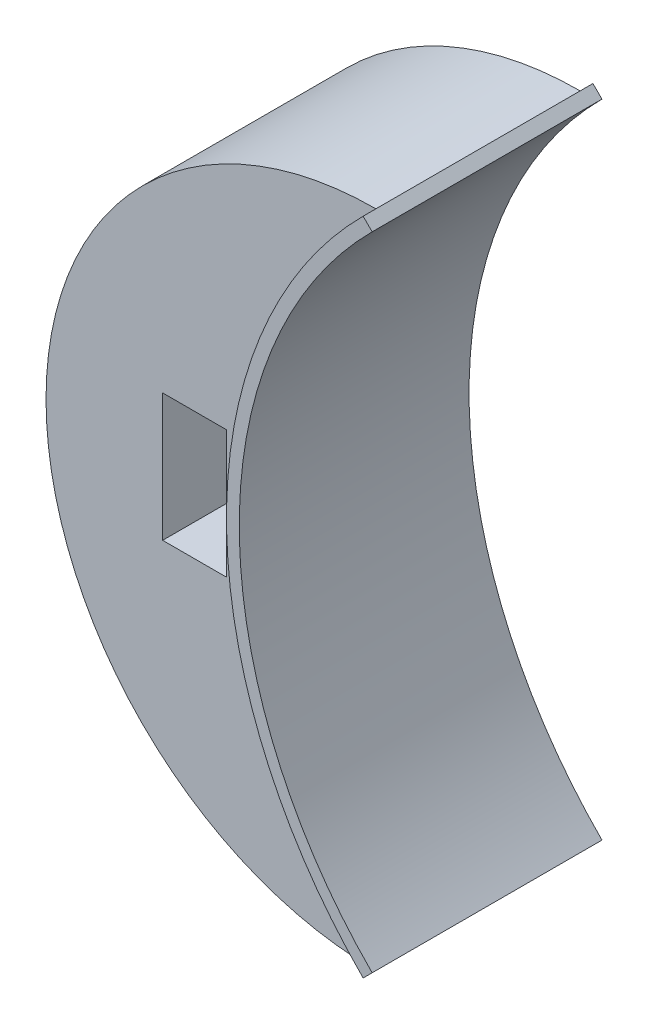
ISO-10303-21;
HEADER;
FILE_DESCRIPTION(('STEP AP214'),'2;1');
FILE_NAME('part.step','',(''),(''),'','','');
FILE_SCHEMA(('AUTOMOTIVE_DESIGN { 1 0 10303 214 1 1 1 1 }'));
ENDSEC;
DATA;
#1=APPLICATION_CONTEXT('core data for automotive mechanical design processes');
#2=APPLICATION_PROTOCOL_DEFINITION('international standard','automotive_design',2000,#1);
#3=PRODUCT_CONTEXT('',#1,'mechanical');
#4=PRODUCT('Part','Part','',(#3));
#5=PRODUCT_RELATED_PRODUCT_CATEGORY('part','',(#4));
#6=PRODUCT_DEFINITION_FORMATION('','',#4);
#7=PRODUCT_DEFINITION_CONTEXT('part definition',#1,'design');
#8=PRODUCT_DEFINITION('design','',#6,#7);
#9=PRODUCT_DEFINITION_SHAPE('','',#8);
#10=(LENGTH_UNIT() NAMED_UNIT(*) SI_UNIT(.MILLI.,.METRE.));
#11=(NAMED_UNIT(*) PLANE_ANGLE_UNIT() SI_UNIT($,.RADIAN.));
#12=(NAMED_UNIT(*) SI_UNIT($,.STERADIAN.) SOLID_ANGLE_UNIT());
#13=UNCERTAINTY_MEASURE_WITH_UNIT(LENGTH_MEASURE(1.E-05),#10,'distance_accuracy_value','');
#14=(GEOMETRIC_REPRESENTATION_CONTEXT(3) GLOBAL_UNCERTAINTY_ASSIGNED_CONTEXT((#13)) GLOBAL_UNIT_ASSIGNED_CONTEXT((#10,
#11,#12)) REPRESENTATION_CONTEXT('',''));
#15=CARTESIAN_POINT('',(0.,0.,0.));
#16=DIRECTION('',(0.,0.,1.));
#17=DIRECTION('',(1.,0.,0.));
#18=AXIS2_PLACEMENT_3D('',#15,#16,#17);
#19=CARTESIAN_POINT('',(0.,0.,9.));
#20=DIRECTION('',(0.,0.,-1.));
#21=DIRECTION('',(-1.,0.,0.));
#22=AXIS2_PLACEMENT_3D('',#19,#20,#21);
#23=CYLINDRICAL_SURFACE('',#22,36.54);
#24=CARTESIAN_POINT('',(0.,0.,-8.));
#25=DIRECTION('',(0.,0.,1.));
#26=DIRECTION('',(1.,0.,0.));
#27=AXIS2_PLACEMENT_3D('',#24,#25,#26);
#28=CIRCLE('',#27,36.54);
#29=CARTESIAN_POINT('',(-25.8376817845566,25.8376817845563,-8.));
#30=VERTEX_POINT('',#29);
#31=CARTESIAN_POINT('',(-25.8376817845563,-25.8376817845566,-8.));
#32=VERTEX_POINT('',#31);
#33=EDGE_CURVE('E156',#30,#32,#28,.T.);
#34=ORIENTED_EDGE('',*,*,#33,.F.);
#35=DIRECTION('',(0.,0.,-1.));
#36=VECTOR('',#35,1.);
#37=CARTESIAN_POINT('',(-25.8376817845566,25.8376817845563,9.));
#38=LINE('',#37,#36);
#39=CARTESIAN_POINT('',(-25.8376817845566,25.8376817845563,-9.));
#40=VERTEX_POINT('',#39);
#41=EDGE_CURVE('E44',#30,#40,#38,.T.);
#42=ORIENTED_EDGE('',*,*,#41,.T.);
#43=CARTESIAN_POINT('',(0.,0.,-9.));
#44=DIRECTION('',(0.,0.,1.));
#45=DIRECTION('',(1.,0.,0.));
#46=AXIS2_PLACEMENT_3D('',#43,#44,#45);
#47=CIRCLE('',#46,36.54);
#48=CARTESIAN_POINT('',(-25.8376817845563,-25.8376817845566,-9.));
#49=VERTEX_POINT('',#48);
#50=EDGE_CURVE('E184',#40,#49,#47,.T.);
#51=ORIENTED_EDGE('',*,*,#50,.T.);
#52=DIRECTION('',(0.,0.,-1.));
#53=VECTOR('',#52,1.);
#54=CARTESIAN_POINT('',(-25.8376817845563,-25.8376817845566,9.));
#55=LINE('',#54,#53);
#56=EDGE_CURVE('E159',#32,#49,#55,.T.);
#57=ORIENTED_EDGE('',*,*,#56,.F.);
#58=EDGE_LOOP('',(#34,#42,#51,#57));
#59=FACE_BOUND('',#58,.T.);
#60=ADVANCED_FACE('F35',(#59),#23,.T.);
#61=CARTESIAN_POINT('',(0.,0.,9.));
#62=DIRECTION('',(-0.707106781186544,-0.707106781186551,0.));
#63=DIRECTION('',(0.707106781186551,-0.707106781186544,0.));
#64=AXIS2_PLACEMENT_3D('',#61,#62,#63);
#65=PLANE('',#64);
#66=DIRECTION('',(-0.707106781186551,0.707106781186544,0.));
#67=VECTOR('',#66,1.);
#68=CARTESIAN_POINT('',(0.,0.,-9.));
#69=LINE('',#68,#67);
#70=CARTESIAN_POINT('',(-25.13057500337,25.1305750033698,-9.));
#71=VERTEX_POINT('',#70);
#72=EDGE_CURVE('E173',#71,#40,#69,.T.);
#73=ORIENTED_EDGE('',*,*,#72,.T.);
#74=ORIENTED_EDGE('',*,*,#41,.F.);
#75=DIRECTION('',(0.,0.,-1.));
#76=VECTOR('',#75,1.);
#77=CARTESIAN_POINT('',(-25.8376817845566,25.8376817845563,8.));
#78=LINE('',#77,#76);
#79=CARTESIAN_POINT('',(-25.8376817845566,25.8376817845563,8.));
#80=VERTEX_POINT('',#79);
#81=EDGE_CURVE('E124',#80,#30,#78,.T.);
#82=ORIENTED_EDGE('',*,*,#81,.F.);
#83=CARTESIAN_POINT('',(-25.8376817845566,25.8376817845563,9.));
#84=VERTEX_POINT('',#83);
#85=EDGE_CURVE('E11',#84,#80,#38,.T.);
#86=ORIENTED_EDGE('',*,*,#85,.F.);
#87=DIRECTION('',(-0.707106781186551,0.707106781186544,0.));
#88=VECTOR('',#87,1.);
#89=CARTESIAN_POINT('',(0.,0.,9.));
#90=LINE('',#89,#88);
#91=CARTESIAN_POINT('',(-25.13057500337,25.1305750033698,9.));
#92=VERTEX_POINT('',#91);
#93=EDGE_CURVE('E174',#92,#84,#90,.T.);
#94=ORIENTED_EDGE('',*,*,#93,.F.);
#95=DIRECTION('',(0.,0.,-1.));
#96=VECTOR('',#95,1.);
#97=CARTESIAN_POINT('',(-25.13057500337,25.1305750033698,9.));
#98=LINE('',#97,#96);
#99=EDGE_CURVE('E52',#92,#71,#98,.T.);
#100=ORIENTED_EDGE('',*,*,#99,.T.);
#101=EDGE_LOOP('',(#73,#74,#82,#86,#94,#100));
#102=FACE_BOUND('',#101,.T.);
#103=ADVANCED_FACE('F37',(#102),#65,.F.);
#104=ORIENTED_EDGE('',*,*,#85,.T.);
#105=CARTESIAN_POINT('',(0.,0.,8.));
#106=DIRECTION('',(0.,0.,1.));
#107=DIRECTION('',(1.,0.,0.));
#108=AXIS2_PLACEMENT_3D('',#105,#106,#107);
#109=CIRCLE('',#108,36.54);
#110=CARTESIAN_POINT('',(-25.8376817845563,-25.8376817845566,8.));
#111=VERTEX_POINT('',#110);
#112=EDGE_CURVE('E131',#80,#111,#109,.T.);
#113=ORIENTED_EDGE('',*,*,#112,.T.);
#114=CARTESIAN_POINT('',(-25.8376817845563,-25.8376817845566,9.));
#115=VERTEX_POINT('',#114);
#116=EDGE_CURVE('E192',#115,#111,#55,.T.);
#117=ORIENTED_EDGE('',*,*,#116,.F.);
#118=CARTESIAN_POINT('',(0.,0.,9.));
#119=DIRECTION('',(0.,0.,1.));
#120=DIRECTION('',(1.,0.,0.));
#121=AXIS2_PLACEMENT_3D('',#118,#119,#120);
#122=CIRCLE('',#121,36.54);
#123=EDGE_CURVE('E78',#84,#115,#122,.T.);
#124=ORIENTED_EDGE('',*,*,#123,.F.);
#125=EDGE_LOOP('',(#104,#113,#117,#124));
#126=FACE_BOUND('',#125,.T.);
#127=ADVANCED_FACE('F140',(#126),#23,.T.);
#128=CARTESIAN_POINT('',(0.,0.,9.));
#129=DIRECTION('',(0.707106781186551,-0.707106781186544,0.));
#130=DIRECTION('',(0.707106781186544,0.707106781186551,0.));
#131=AXIS2_PLACEMENT_3D('',#128,#129,#130);
#132=PLANE('',#131);
#133=DIRECTION('',(-0.707106781186544,-0.707106781186551,0.));
#134=VECTOR('',#133,1.);
#135=CARTESIAN_POINT('',(0.,0.,-9.));
#136=LINE('',#135,#134);
#137=CARTESIAN_POINT('',(-25.1305750033698,-25.13057500337,-9.));
#138=VERTEX_POINT('',#137);
#139=EDGE_CURVE('E186',#138,#49,#136,.T.);
#140=ORIENTED_EDGE('',*,*,#139,.F.);
#141=DIRECTION('',(0.,0.,-1.));
#142=VECTOR('',#141,1.);
#143=CARTESIAN_POINT('',(-25.1305750033698,-25.13057500337,9.));
#144=LINE('',#143,#142);
#145=CARTESIAN_POINT('',(-25.1305750033698,-25.13057500337,9.));
#146=VERTEX_POINT('',#145);
#147=EDGE_CURVE('E67',#146,#138,#144,.T.);
#148=ORIENTED_EDGE('',*,*,#147,.F.);
#149=DIRECTION('',(-0.707106781186544,-0.707106781186551,0.));
#150=VECTOR('',#149,1.);
#151=CARTESIAN_POINT('',(0.,0.,9.));
#152=LINE('',#151,#150);
#153=EDGE_CURVE('E178',#146,#115,#152,.T.);
#154=ORIENTED_EDGE('',*,*,#153,.T.);
#155=ORIENTED_EDGE('',*,*,#116,.T.);
#156=DIRECTION('',(0.,0.,-1.));
#157=VECTOR('',#156,1.);
#158=CARTESIAN_POINT('',(-25.8376817845563,-25.8376817845566,8.));
#159=LINE('',#158,#157);
#160=EDGE_CURVE('E126',#111,#32,#159,.T.);
#161=ORIENTED_EDGE('',*,*,#160,.T.);
#162=ORIENTED_EDGE('',*,*,#56,.T.);
#163=EDGE_LOOP('',(#140,#148,#154,#155,#161,#162));
#164=FACE_BOUND('',#163,.T.);
#165=ADVANCED_FACE('F142',(#164),#132,.T.);
#166=CARTESIAN_POINT('',(0.,0.,9.));
#167=DIRECTION('',(0.,0.,-1.));
#168=DIRECTION('',(-1.,0.,0.));
#169=AXIS2_PLACEMENT_3D('',#166,#167,#168);
#170=CYLINDRICAL_SURFACE('',#169,35.54);
#171=CARTESIAN_POINT('',(0.,0.,-9.));
#172=DIRECTION('',(0.,0.,1.));
#173=DIRECTION('',(1.,0.,0.));
#174=AXIS2_PLACEMENT_3D('',#171,#172,#173);
#175=CIRCLE('',#174,35.54);
#176=EDGE_CURVE('E176',#71,#138,#175,.T.);
#177=ORIENTED_EDGE('',*,*,#176,.F.);
#178=ORIENTED_EDGE('',*,*,#99,.F.);
#179=CARTESIAN_POINT('',(0.,0.,9.));
#180=DIRECTION('',(0.,0.,1.));
#181=DIRECTION('',(1.,0.,0.));
#182=AXIS2_PLACEMENT_3D('',#179,#180,#181);
#183=CIRCLE('',#182,35.54);
#184=EDGE_CURVE('E181',#92,#146,#183,.T.);
#185=ORIENTED_EDGE('',*,*,#184,.T.);
#186=ORIENTED_EDGE('',*,*,#147,.T.);
#187=EDGE_LOOP('',(#177,#178,#185,#186));
#188=FACE_BOUND('',#187,.T.);
#189=ADVANCED_FACE('F147',(#188),#170,.F.);
#190=CARTESIAN_POINT('',(0.,0.,9.));
#191=DIRECTION('',(0.,0.,1.));
#192=DIRECTION('',(1.,0.,0.));
#193=AXIS2_PLACEMENT_3D('',#190,#191,#192);
#194=PLANE('',#193);
#195=ORIENTED_EDGE('',*,*,#93,.T.);
#196=ORIENTED_EDGE('',*,*,#123,.T.);
#197=ORIENTED_EDGE('',*,*,#153,.F.);
#198=ORIENTED_EDGE('',*,*,#184,.F.);
#199=EDGE_LOOP('',(#195,#196,#197,#198));
#200=FACE_BOUND('',#199,.T.);
#201=ADVANCED_FACE('F196',(#200),#194,.T.);
#202=CARTESIAN_POINT('',(0.,0.,-9.));
#203=DIRECTION('',(0.,0.,1.));
#204=DIRECTION('',(1.,0.,0.));
#205=AXIS2_PLACEMENT_3D('',#202,#203,#204);
#206=PLANE('',#205);
#207=ORIENTED_EDGE('',*,*,#72,.F.);
#208=ORIENTED_EDGE('',*,*,#176,.T.);
#209=ORIENTED_EDGE('',*,*,#139,.T.);
#210=ORIENTED_EDGE('',*,*,#50,.F.);
#211=EDGE_LOOP('',(#207,#208,#209,#210));
#212=FACE_BOUND('',#211,.T.);
#213=ADVANCED_FACE('F194',(#212),#206,.F.);
#214=CARTESIAN_POINT('',(-37.54,0.,8.));
#215=DIRECTION('',(1.,0.,0.));
#216=DIRECTION('',(0.,0.,-1.));
#217=AXIS2_PLACEMENT_3D('',#214,#215,#216);
#218=PLANE('',#217);
#219=DIRECTION('',(0.,-1.,0.));
#220=VECTOR('',#219,1.);
#221=CARTESIAN_POINT('',(-37.54,0.,-8.));
#222=LINE('',#221,#220);
#223=CARTESIAN_POINT('',(-37.54,5.,-8.));
#224=VERTEX_POINT('',#223);
#225=CARTESIAN_POINT('',(-37.54,-5.,-8.));
#226=VERTEX_POINT('',#225);
#227=EDGE_CURVE('E161',#224,#226,#222,.T.);
#228=ORIENTED_EDGE('',*,*,#227,.T.);
#229=DIRECTION('',(0.,0.,-1.));
#230=VECTOR('',#229,1.);
#231=CARTESIAN_POINT('',(-37.54,-5.,8.));
#232=LINE('',#231,#230);
#233=CARTESIAN_POINT('',(-37.54,-5.,8.));
#234=VERTEX_POINT('',#233);
#235=EDGE_CURVE('E170',#234,#226,#232,.T.);
#236=ORIENTED_EDGE('',*,*,#235,.F.);
#237=DIRECTION('',(0.,-1.,0.));
#238=VECTOR('',#237,1.);
#239=CARTESIAN_POINT('',(-37.54,0.,8.));
#240=LINE('',#239,#238);
#241=CARTESIAN_POINT('',(-37.54,5.,8.));
#242=VERTEX_POINT('',#241);
#243=EDGE_CURVE('E135',#242,#234,#240,.T.);
#244=ORIENTED_EDGE('',*,*,#243,.F.);
#245=DIRECTION('',(0.,0.,-1.));
#246=VECTOR('',#245,1.);
#247=CARTESIAN_POINT('',(-37.54,5.,8.));
#248=LINE('',#247,#246);
#249=EDGE_CURVE('E134',#242,#224,#248,.T.);
#250=ORIENTED_EDGE('',*,*,#249,.T.);
#251=EDGE_LOOP('',(#228,#236,#244,#250));
#252=FACE_BOUND('',#251,.T.);
#253=ADVANCED_FACE('F205',(#252),#218,.F.);
#254=CARTESIAN_POINT('',(0.,0.,8.));
#255=DIRECTION('',(0.,0.,1.));
#256=DIRECTION('',(1.,0.,0.));
#257=AXIS2_PLACEMENT_3D('',#254,#255,#256);
#258=PLANE('',#257);
#259=DIRECTION('',(0.,1.,0.));
#260=VECTOR('',#259,1.);
#261=CARTESIAN_POINT('',(-42.54,5.,8.));
#262=LINE('',#261,#260);
#263=CARTESIAN_POINT('',(-42.54,-5.00000000000001,8.));
#264=VERTEX_POINT('',#263);
#265=CARTESIAN_POINT('',(-42.54,5.,8.));
#266=VERTEX_POINT('',#265);
#267=EDGE_CURVE('E128',#264,#266,#262,.T.);
#268=ORIENTED_EDGE('',*,*,#267,.T.);
#269=DIRECTION('',(1.,0.,0.));
#270=VECTOR('',#269,1.);
#271=CARTESIAN_POINT('',(-42.54,5.,8.));
#272=LINE('',#271,#270);
#273=EDGE_CURVE('E247',#266,#242,#272,.T.);
#274=ORIENTED_EDGE('',*,*,#273,.T.);
#275=ORIENTED_EDGE('',*,*,#243,.T.);
#276=DIRECTION('',(-1.,0.,0.));
#277=VECTOR('',#276,1.);
#278=CARTESIAN_POINT('',(-42.54,-5.00000000000001,8.));
#279=LINE('',#278,#277);
#280=EDGE_CURVE('E254',#234,#264,#279,.T.);
#281=ORIENTED_EDGE('',*,*,#280,.T.);
#282=EDGE_LOOP('',(#268,#274,#275,#281));
#283=FACE_BOUND('',#282,.T.);
#284=ORIENTED_EDGE('',*,*,#112,.F.);
#285=CARTESIAN_POINT('',(-25.8376817845565,-1.42247325030098E-13,8.));
#286=DIRECTION('',(0.,0.,1.));
#287=DIRECTION('',(1.,0.,0.));
#288=AXIS2_PLACEMENT_3D('',#285,#286,#287);
#289=CIRCLE('',#288,25.8376817845564);
#290=EDGE_CURVE('E119',#80,#111,#289,.T.);
#291=ORIENTED_EDGE('',*,*,#290,.T.);
#292=EDGE_LOOP('',(#284,#291));
#293=FACE_BOUND('',#292,.T.);
#294=ADVANCED_FACE('F132',(#283,#293),#258,.T.);
#295=CARTESIAN_POINT('',(0.,0.,-8.));
#296=DIRECTION('',(0.,0.,1.));
#297=DIRECTION('',(1.,0.,0.));
#298=AXIS2_PLACEMENT_3D('',#295,#296,#297);
#299=PLANE('',#298);
#300=DIRECTION('',(1.,0.,0.));
#301=VECTOR('',#300,1.);
#302=CARTESIAN_POINT('',(-42.54,5.,-8.));
#303=LINE('',#302,#301);
#304=CARTESIAN_POINT('',(-42.54,5.,-8.));
#305=VERTEX_POINT('',#304);
#306=EDGE_CURVE('E245',#305,#224,#303,.T.);
#307=ORIENTED_EDGE('',*,*,#306,.F.);
#308=DIRECTION('',(0.,1.,0.));
#309=VECTOR('',#308,1.);
#310=CARTESIAN_POINT('',(-42.54,5.,-8.));
#311=LINE('',#310,#309);
#312=CARTESIAN_POINT('',(-42.54,-5.00000000000001,-8.));
#313=VERTEX_POINT('',#312);
#314=EDGE_CURVE('E129',#313,#305,#311,.T.);
#315=ORIENTED_EDGE('',*,*,#314,.F.);
#316=DIRECTION('',(-1.,0.,0.));
#317=VECTOR('',#316,1.);
#318=CARTESIAN_POINT('',(-42.54,-5.00000000000001,-8.));
#319=LINE('',#318,#317);
#320=EDGE_CURVE('E255',#226,#313,#319,.T.);
#321=ORIENTED_EDGE('',*,*,#320,.F.);
#322=ORIENTED_EDGE('',*,*,#227,.F.);
#323=EDGE_LOOP('',(#307,#315,#321,#322));
#324=FACE_BOUND('',#323,.T.);
#325=CARTESIAN_POINT('',(-25.8376817845565,-1.42247325030098E-13,-8.));
#326=DIRECTION('',(0.,0.,1.));
#327=DIRECTION('',(1.,0.,0.));
#328=AXIS2_PLACEMENT_3D('',#325,#326,#327);
#329=CIRCLE('',#328,25.8376817845564);
#330=EDGE_CURVE('E242',#30,#32,#329,.T.);
#331=ORIENTED_EDGE('',*,*,#330,.F.);
#332=ORIENTED_EDGE('',*,*,#33,.T.);
#333=EDGE_LOOP('',(#331,#332));
#334=FACE_BOUND('',#333,.T.);
#335=ADVANCED_FACE('F210',(#324,#334),#299,.F.);
#336=CARTESIAN_POINT('',(-42.54,5.,8.));
#337=DIRECTION('',(0.,1.,0.));
#338=DIRECTION('',(-1.,0.,0.));
#339=AXIS2_PLACEMENT_3D('',#336,#337,#338);
#340=PLANE('',#339);
#341=ORIENTED_EDGE('',*,*,#306,.T.);
#342=ORIENTED_EDGE('',*,*,#249,.F.);
#343=ORIENTED_EDGE('',*,*,#273,.F.);
#344=DIRECTION('',(0.,0.,-1.));
#345=VECTOR('',#344,1.);
#346=CARTESIAN_POINT('',(-42.54,5.,8.));
#347=LINE('',#346,#345);
#348=EDGE_CURVE('E164',#266,#305,#347,.T.);
#349=ORIENTED_EDGE('',*,*,#348,.T.);
#350=EDGE_LOOP('',(#341,#342,#343,#349));
#351=FACE_BOUND('',#350,.T.);
#352=ADVANCED_FACE('F213',(#351),#340,.F.);
#353=CARTESIAN_POINT('',(-42.54,-5.00000000000001,8.));
#354=DIRECTION('',(0.,-1.,0.));
#355=DIRECTION('',(1.,0.,0.));
#356=AXIS2_PLACEMENT_3D('',#353,#354,#355);
#357=PLANE('',#356);
#358=ORIENTED_EDGE('',*,*,#320,.T.);
#359=DIRECTION('',(0.,0.,-1.));
#360=VECTOR('',#359,1.);
#361=CARTESIAN_POINT('',(-42.54,-5.00000000000001,8.));
#362=LINE('',#361,#360);
#363=EDGE_CURVE('E240',#264,#313,#362,.T.);
#364=ORIENTED_EDGE('',*,*,#363,.F.);
#365=ORIENTED_EDGE('',*,*,#280,.F.);
#366=ORIENTED_EDGE('',*,*,#235,.T.);
#367=EDGE_LOOP('',(#358,#364,#365,#366));
#368=FACE_BOUND('',#367,.T.);
#369=ADVANCED_FACE('F220',(#368),#357,.F.);
#370=CARTESIAN_POINT('',(-25.8376817845565,-1.42247325030098E-13,8.));
#371=DIRECTION('',(0.,0.,-1.));
#372=DIRECTION('',(-1.,0.,0.));
#373=AXIS2_PLACEMENT_3D('',#370,#371,#372);
#374=CYLINDRICAL_SURFACE('',#373,25.8376817845564);
#375=ORIENTED_EDGE('',*,*,#330,.T.);
#376=ORIENTED_EDGE('',*,*,#160,.F.);
#377=ORIENTED_EDGE('',*,*,#290,.F.);
#378=ORIENTED_EDGE('',*,*,#81,.T.);
#379=EDGE_LOOP('',(#375,#376,#377,#378));
#380=FACE_BOUND('',#379,.T.);
#381=ADVANCED_FACE('F122',(#380),#374,.T.);
#382=CARTESIAN_POINT('',(-42.54,5.,8.));
#383=DIRECTION('',(-1.,0.,0.));
#384=DIRECTION('',(0.,0.,1.));
#385=AXIS2_PLACEMENT_3D('',#382,#383,#384);
#386=PLANE('',#385);
#387=ORIENTED_EDGE('',*,*,#314,.T.);
#388=ORIENTED_EDGE('',*,*,#348,.F.);
#389=ORIENTED_EDGE('',*,*,#267,.F.);
#390=ORIENTED_EDGE('',*,*,#363,.T.);
#391=EDGE_LOOP('',(#387,#388,#389,#390));
#392=FACE_BOUND('',#391,.T.);
#393=ADVANCED_FACE('F227',(#392),#386,.F.);
#394=CLOSED_SHELL('',(#60,#103,#127,#165,#189,#201,#213,#253,#294,#335,#352,#369,#381,#393));
#395=MANIFOLD_SOLID_BREP('B2',#394);
#396=ADVANCED_BREP_SHAPE_REPRESENTATION('',(#18,#395),#14);
#397=SHAPE_DEFINITION_REPRESENTATION(#9,#396);
ENDSEC;
END-ISO-10303-21;
